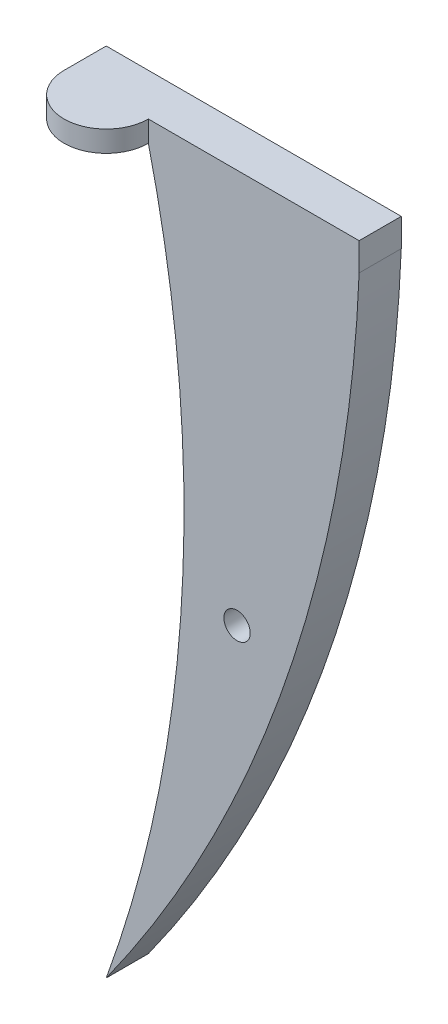
ISO-10303-21;
HEADER;
FILE_DESCRIPTION(('STEP AP214'),'2;1');
FILE_NAME('part.step','',(''),(''),'','','');
FILE_SCHEMA(('AUTOMOTIVE_DESIGN { 1 0 10303 214 1 1 1 1 }'));
ENDSEC;
DATA;
#1=APPLICATION_CONTEXT('core data for automotive mechanical design processes');
#2=APPLICATION_PROTOCOL_DEFINITION('international standard','automotive_design',2000,#1);
#3=PRODUCT_CONTEXT('',#1,'mechanical');
#4=PRODUCT('Part','Part','',(#3));
#5=PRODUCT_RELATED_PRODUCT_CATEGORY('part','',(#4));
#6=PRODUCT_DEFINITION_FORMATION('','',#4);
#7=PRODUCT_DEFINITION_CONTEXT('part definition',#1,'design');
#8=PRODUCT_DEFINITION('design','',#6,#7);
#9=PRODUCT_DEFINITION_SHAPE('','',#8);
#10=(LENGTH_UNIT() NAMED_UNIT(*) SI_UNIT(.MILLI.,.METRE.));
#11=(NAMED_UNIT(*) PLANE_ANGLE_UNIT() SI_UNIT($,.RADIAN.));
#12=(NAMED_UNIT(*) SI_UNIT($,.STERADIAN.) SOLID_ANGLE_UNIT());
#13=UNCERTAINTY_MEASURE_WITH_UNIT(LENGTH_MEASURE(1.E-05),#10,'distance_accuracy_value','');
#14=(GEOMETRIC_REPRESENTATION_CONTEXT(3) GLOBAL_UNCERTAINTY_ASSIGNED_CONTEXT((#13)) GLOBAL_UNIT_ASSIGNED_CONTEXT((#10,
#11,#12)) REPRESENTATION_CONTEXT('',''));
#15=CARTESIAN_POINT('',(0.,0.,0.));
#16=DIRECTION('',(0.,0.,1.));
#17=DIRECTION('',(1.,0.,0.));
#18=AXIS2_PLACEMENT_3D('',#15,#16,#17);
#19=CARTESIAN_POINT('',(17.78,92.202,2.54));
#20=DIRECTION('',(0.,0.,-1.));
#21=DIRECTION('',(-1.,0.,0.));
#22=AXIS2_PLACEMENT_3D('',#19,#20,#21);
#23=PLANE('',#22);
#24=CARTESIAN_POINT('',(3.06994423932012,44.6786,2.54));
#25=DIRECTION('',(0.,0.,1.));
#26=DIRECTION('',(1.,0.,0.));
#27=AXIS2_PLACEMENT_3D('',#24,#25,#26);
#28=CIRCLE('',#27,1.5875);
#29=CARTESIAN_POINT('',(4.65744423932012,44.6786,2.54));
#30=VERTEX_POINT('',#29);
#31=EDGE_CURVE('E205',#30,#30,#28,.T.);
#32=ORIENTED_EDGE('',*,*,#31,.F.);
#33=EDGE_LOOP('',(#32));
#34=FACE_BOUND('',#33,.T.);
#35=CARTESIAN_POINT('',(-145.670168631569,95.26982308931,2.54));
#36=DIRECTION('',(0.,0.,1.));
#37=DIRECTION('',(1.,0.,0.));
#38=AXIS2_PLACEMENT_3D('',#35,#36,#37);
#39=CIRCLE('',#38,163.576908325644);
#40=CARTESIAN_POINT('',(-12.7,0.,2.54));
#41=VERTEX_POINT('',#40);
#42=CARTESIAN_POINT('',(17.78,88.831864430853,2.54));
#43=VERTEX_POINT('',#42);
#44=EDGE_CURVE('E134',#41,#43,#39,.T.);
#45=ORIENTED_EDGE('',*,*,#44,.T.);
#46=DIRECTION('',(0.,-1.,0.));
#47=VECTOR('',#46,1.);
#48=CARTESIAN_POINT('',(17.78,92.202,2.54));
#49=LINE('',#48,#47);
#50=CARTESIAN_POINT('',(17.78,92.202,2.54));
#51=VERTEX_POINT('',#50);
#52=EDGE_CURVE('E12',#51,#43,#49,.T.);
#53=ORIENTED_EDGE('',*,*,#52,.F.);
#54=DIRECTION('',(1.,0.,0.));
#55=VECTOR('',#54,1.);
#56=CARTESIAN_POINT('',(17.78,92.202,2.54));
#57=LINE('',#56,#55);
#58=CARTESIAN_POINT('',(-7.61999999999999,92.202,2.54));
#59=VERTEX_POINT('',#58);
#60=EDGE_CURVE('E150',#59,#51,#57,.T.);
#61=ORIENTED_EDGE('',*,*,#60,.F.);
#62=DIRECTION('',(0.,1.,0.));
#63=VECTOR('',#62,1.);
#64=CARTESIAN_POINT('',(-7.62,92.202,2.54));
#65=LINE('',#64,#63);
#66=CARTESIAN_POINT('',(-7.62,89.662,2.54));
#67=VERTEX_POINT('',#66);
#68=EDGE_CURVE('E163',#67,#59,#65,.T.);
#69=ORIENTED_EDGE('',*,*,#68,.F.);
#70=CARTESIAN_POINT('',(-159.474143935706,53.2907248688785,2.54));
#71=DIRECTION('',(0.,0.,1.));
#72=DIRECTION('',(1.,0.,0.));
#73=AXIS2_PLACEMENT_3D('',#70,#71,#72);
#74=CIRCLE('',#73,156.149129632893);
#75=EDGE_CURVE('E147',#41,#67,#74,.T.);
#76=ORIENTED_EDGE('',*,*,#75,.F.);
#77=EDGE_LOOP('',(#45,#53,#61,#69,#76));
#78=FACE_BOUND('',#77,.T.);
#79=ADVANCED_FACE('F74',(#34,#78),#23,.F.);
#80=CARTESIAN_POINT('',(17.78,92.202,2.54));
#81=DIRECTION('',(-1.,0.,0.));
#82=DIRECTION('',(0.,0.,1.));
#83=AXIS2_PLACEMENT_3D('',#80,#81,#82);
#84=PLANE('',#83);
#85=DIRECTION('',(0.,0.,1.));
#86=VECTOR('',#85,1.);
#87=CARTESIAN_POINT('',(17.78,88.831864430853,-2.54));
#88=LINE('',#87,#86);
#89=CARTESIAN_POINT('',(17.78,88.831864430853,-2.54));
#90=VERTEX_POINT('',#89);
#91=EDGE_CURVE('E131',#90,#43,#88,.T.);
#92=ORIENTED_EDGE('',*,*,#91,.F.);
#93=DIRECTION('',(0.,-1.,0.));
#94=VECTOR('',#93,1.);
#95=CARTESIAN_POINT('',(17.78,92.202,-2.54));
#96=LINE('',#95,#94);
#97=CARTESIAN_POINT('',(17.78,92.202,-2.54));
#98=VERTEX_POINT('',#97);
#99=EDGE_CURVE('E83',#98,#90,#96,.T.);
#100=ORIENTED_EDGE('',*,*,#99,.F.);
#101=DIRECTION('',(0.,0.,-1.));
#102=VECTOR('',#101,1.);
#103=CARTESIAN_POINT('',(17.78,92.202,2.54));
#104=LINE('',#103,#102);
#105=EDGE_CURVE('E96',#51,#98,#104,.T.);
#106=ORIENTED_EDGE('',*,*,#105,.F.);
#107=ORIENTED_EDGE('',*,*,#52,.T.);
#108=EDGE_LOOP('',(#92,#100,#106,#107));
#109=FACE_BOUND('',#108,.T.);
#110=ADVANCED_FACE('F149',(#109),#84,.F.);
#111=CARTESIAN_POINT('',(17.78,92.202,-2.54));
#112=DIRECTION('',(0.,0.,1.));
#113=DIRECTION('',(1.,0.,0.));
#114=AXIS2_PLACEMENT_3D('',#111,#112,#113);
#115=PLANE('',#114);
#116=CARTESIAN_POINT('',(3.06994423932012,44.6786,-2.54));
#117=DIRECTION('',(0.,0.,1.));
#118=DIRECTION('',(1.,0.,0.));
#119=AXIS2_PLACEMENT_3D('',#116,#117,#118);
#120=CIRCLE('',#119,1.5875);
#121=CARTESIAN_POINT('',(4.65744423932012,44.6786,-2.54));
#122=VERTEX_POINT('',#121);
#123=EDGE_CURVE('E78',#122,#122,#120,.T.);
#124=ORIENTED_EDGE('',*,*,#123,.T.);
#125=EDGE_LOOP('',(#124));
#126=FACE_BOUND('',#125,.T.);
#127=CARTESIAN_POINT('',(-145.670168631569,95.26982308931,-2.54));
#128=DIRECTION('',(0.,0.,1.));
#129=DIRECTION('',(1.,0.,0.));
#130=AXIS2_PLACEMENT_3D('',#127,#128,#129);
#131=CIRCLE('',#130,163.576908325644);
#132=CARTESIAN_POINT('',(-12.7,0.,-2.54));
#133=VERTEX_POINT('',#132);
#134=EDGE_CURVE('E137',#133,#90,#131,.T.);
#135=ORIENTED_EDGE('',*,*,#134,.F.);
#136=CARTESIAN_POINT('',(-159.474143935706,53.2907248688785,-2.54));
#137=DIRECTION('',(0.,0.,1.));
#138=DIRECTION('',(1.,0.,0.));
#139=AXIS2_PLACEMENT_3D('',#136,#137,#138);
#140=CIRCLE('',#139,156.149129632893);
#141=CARTESIAN_POINT('',(-7.62,89.662,-2.54));
#142=VERTEX_POINT('',#141);
#143=EDGE_CURVE('E199',#133,#142,#140,.T.);
#144=ORIENTED_EDGE('',*,*,#143,.T.);
#145=DIRECTION('',(-1.,0.,0.));
#146=VECTOR('',#145,1.);
#147=CARTESIAN_POINT('',(0.,89.662,-2.54));
#148=LINE('',#147,#146);
#149=CARTESIAN_POINT('',(-17.78,89.662,-2.54));
#150=VERTEX_POINT('',#149);
#151=EDGE_CURVE('E196',#142,#150,#148,.T.);
#152=ORIENTED_EDGE('',*,*,#151,.T.);
#153=DIRECTION('',(0.,-1.,0.));
#154=VECTOR('',#153,1.);
#155=CARTESIAN_POINT('',(-17.78,92.202,-2.54));
#156=LINE('',#155,#154);
#157=CARTESIAN_POINT('',(-17.78,92.202,-2.54));
#158=VERTEX_POINT('',#157);
#159=EDGE_CURVE('E152',#158,#150,#156,.T.);
#160=ORIENTED_EDGE('',*,*,#159,.F.);
#161=DIRECTION('',(-1.,0.,0.));
#162=VECTOR('',#161,1.);
#163=CARTESIAN_POINT('',(17.78,92.202,-2.54));
#164=LINE('',#163,#162);
#165=EDGE_CURVE('E91',#98,#158,#164,.T.);
#166=ORIENTED_EDGE('',*,*,#165,.F.);
#167=ORIENTED_EDGE('',*,*,#99,.T.);
#168=EDGE_LOOP('',(#135,#144,#152,#160,#166,#167));
#169=FACE_BOUND('',#168,.T.);
#170=ADVANCED_FACE('F212',(#126,#169),#115,.F.);
#171=CARTESIAN_POINT('',(0.,92.202,0.));
#172=DIRECTION('',(0.,1.,0.));
#173=DIRECTION('',(0.,0.,1.));
#174=AXIS2_PLACEMENT_3D('',#171,#172,#173);
#175=PLANE('',#174);
#176=CARTESIAN_POINT('',(-12.7,92.202,2.54));
#177=DIRECTION('',(0.,1.,0.));
#178=DIRECTION('',(0.,0.,1.));
#179=AXIS2_PLACEMENT_3D('',#176,#177,#178);
#180=CIRCLE('',#179,5.08);
#181=CARTESIAN_POINT('',(-17.78,92.202,2.54));
#182=VERTEX_POINT('',#181);
#183=EDGE_CURVE('E175',#182,#59,#180,.T.);
#184=ORIENTED_EDGE('',*,*,#183,.T.);
#185=ORIENTED_EDGE('',*,*,#60,.T.);
#186=ORIENTED_EDGE('',*,*,#105,.T.);
#187=ORIENTED_EDGE('',*,*,#165,.T.);
#188=DIRECTION('',(0.,0.,1.));
#189=VECTOR('',#188,1.);
#190=CARTESIAN_POINT('',(-17.78,92.202,2.54));
#191=LINE('',#190,#189);
#192=EDGE_CURVE('E154',#158,#182,#191,.T.);
#193=ORIENTED_EDGE('',*,*,#192,.T.);
#194=EDGE_LOOP('',(#184,#185,#186,#187,#193));
#195=FACE_BOUND('',#194,.T.);
#196=ADVANCED_FACE('F174',(#195),#175,.T.);
#197=CARTESIAN_POINT('',(-17.78,89.662,7.62));
#198=DIRECTION('',(0.,1.,0.));
#199=DIRECTION('',(0.,0.,1.));
#200=AXIS2_PLACEMENT_3D('',#197,#198,#199);
#201=PLANE('',#200);
#202=CARTESIAN_POINT('',(-12.7,89.662,2.54));
#203=DIRECTION('',(0.,1.,0.));
#204=DIRECTION('',(0.,0.,1.));
#205=AXIS2_PLACEMENT_3D('',#202,#203,#204);
#206=CIRCLE('',#205,5.08);
#207=CARTESIAN_POINT('',(-17.78,89.662,2.54));
#208=VERTEX_POINT('',#207);
#209=EDGE_CURVE('E183',#208,#67,#206,.T.);
#210=ORIENTED_EDGE('',*,*,#209,.F.);
#211=DIRECTION('',(0.,0.,1.));
#212=VECTOR('',#211,1.);
#213=CARTESIAN_POINT('',(-17.78,89.662,-2.54));
#214=LINE('',#213,#212);
#215=EDGE_CURVE('E179',#150,#208,#214,.T.);
#216=ORIENTED_EDGE('',*,*,#215,.F.);
#217=ORIENTED_EDGE('',*,*,#151,.F.);
#218=DIRECTION('',(0.,0.,1.));
#219=VECTOR('',#218,1.);
#220=CARTESIAN_POINT('',(-7.62,89.662,-2.54));
#221=LINE('',#220,#219);
#222=EDGE_CURVE('E192',#142,#67,#221,.T.);
#223=ORIENTED_EDGE('',*,*,#222,.T.);
#224=EDGE_LOOP('',(#210,#216,#217,#223));
#225=FACE_BOUND('',#224,.T.);
#226=ADVANCED_FACE('F234',(#225),#201,.F.);
#227=CARTESIAN_POINT('',(-17.78,92.202,2.54));
#228=DIRECTION('',(1.,0.,0.));
#229=DIRECTION('',(0.,0.,-1.));
#230=AXIS2_PLACEMENT_3D('',#227,#228,#229);
#231=PLANE('',#230);
#232=ORIENTED_EDGE('',*,*,#159,.T.);
#233=ORIENTED_EDGE('',*,*,#215,.T.);
#234=DIRECTION('',(0.,1.,0.));
#235=VECTOR('',#234,1.);
#236=CARTESIAN_POINT('',(-17.78,89.662,2.54));
#237=LINE('',#236,#235);
#238=EDGE_CURVE('E167',#208,#182,#237,.T.);
#239=ORIENTED_EDGE('',*,*,#238,.T.);
#240=ORIENTED_EDGE('',*,*,#192,.F.);
#241=EDGE_LOOP('',(#232,#233,#239,#240));
#242=FACE_BOUND('',#241,.T.);
#243=ADVANCED_FACE('F76',(#242),#231,.F.);
#244=CARTESIAN_POINT('',(-12.7,89.662,2.54));
#245=DIRECTION('',(0.,1.,0.));
#246=DIRECTION('',(0.,0.,1.));
#247=AXIS2_PLACEMENT_3D('',#244,#245,#246);
#248=CYLINDRICAL_SURFACE('',#247,5.08);
#249=ORIENTED_EDGE('',*,*,#183,.F.);
#250=ORIENTED_EDGE('',*,*,#238,.F.);
#251=ORIENTED_EDGE('',*,*,#209,.T.);
#252=ORIENTED_EDGE('',*,*,#68,.T.);
#253=EDGE_LOOP('',(#249,#250,#251,#252));
#254=FACE_BOUND('',#253,.T.);
#255=ADVANCED_FACE('F237',(#254),#248,.T.);
#256=CARTESIAN_POINT('',(-159.474143935706,53.2907248688785,-2.54));
#257=DIRECTION('',(0.,0.,1.));
#258=DIRECTION('',(1.,0.,0.));
#259=AXIS2_PLACEMENT_3D('',#256,#257,#258);
#260=CYLINDRICAL_SURFACE('',#259,156.149129632893);
#261=ORIENTED_EDGE('',*,*,#75,.T.);
#262=ORIENTED_EDGE('',*,*,#222,.F.);
#263=ORIENTED_EDGE('',*,*,#143,.F.);
#264=DIRECTION('',(0.,0.,1.));
#265=VECTOR('',#264,1.);
#266=CARTESIAN_POINT('',(-12.7,0.,-2.54));
#267=LINE('',#266,#265);
#268=EDGE_CURVE('E171',#133,#41,#267,.T.);
#269=ORIENTED_EDGE('',*,*,#268,.T.);
#270=EDGE_LOOP('',(#261,#262,#263,#269));
#271=FACE_BOUND('',#270,.T.);
#272=ADVANCED_FACE('F221',(#271),#260,.F.);
#273=CARTESIAN_POINT('',(-145.670168631569,95.26982308931,-2.54));
#274=DIRECTION('',(0.,0.,1.));
#275=DIRECTION('',(1.,0.,0.));
#276=AXIS2_PLACEMENT_3D('',#273,#274,#275);
#277=CYLINDRICAL_SURFACE('',#276,163.576908325644);
#278=ORIENTED_EDGE('',*,*,#44,.F.);
#279=ORIENTED_EDGE('',*,*,#268,.F.);
#280=ORIENTED_EDGE('',*,*,#134,.T.);
#281=ORIENTED_EDGE('',*,*,#91,.T.);
#282=EDGE_LOOP('',(#278,#279,#280,#281));
#283=FACE_BOUND('',#282,.T.);
#284=ADVANCED_FACE('F133',(#283),#277,.T.);
#285=CARTESIAN_POINT('',(3.06994423932012,44.6786,-2.540025));
#286=DIRECTION('',(0.,0.,1.));
#287=DIRECTION('',(1.,0.,0.));
#288=AXIS2_PLACEMENT_3D('',#285,#286,#287);
#289=CYLINDRICAL_SURFACE('',#288,1.5875);
#290=ORIENTED_EDGE('',*,*,#31,.T.);
#291=EDGE_LOOP('',(#290));
#292=FACE_BOUND('',#291,.T.);
#293=ORIENTED_EDGE('',*,*,#123,.F.);
#294=EDGE_LOOP('',(#293));
#295=FACE_BOUND('',#294,.T.);
#296=ADVANCED_FACE('F215',(#292,#295),#289,.F.);
#297=CLOSED_SHELL('',(#79,#110,#170,#196,#226,#243,#255,#272,#284,#296));
#298=MANIFOLD_SOLID_BREP('B2',#297);
#299=ADVANCED_BREP_SHAPE_REPRESENTATION('',(#18,#298),#14);
#300=SHAPE_DEFINITION_REPRESENTATION(#9,#299);
ENDSEC;
END-ISO-10303-21;
